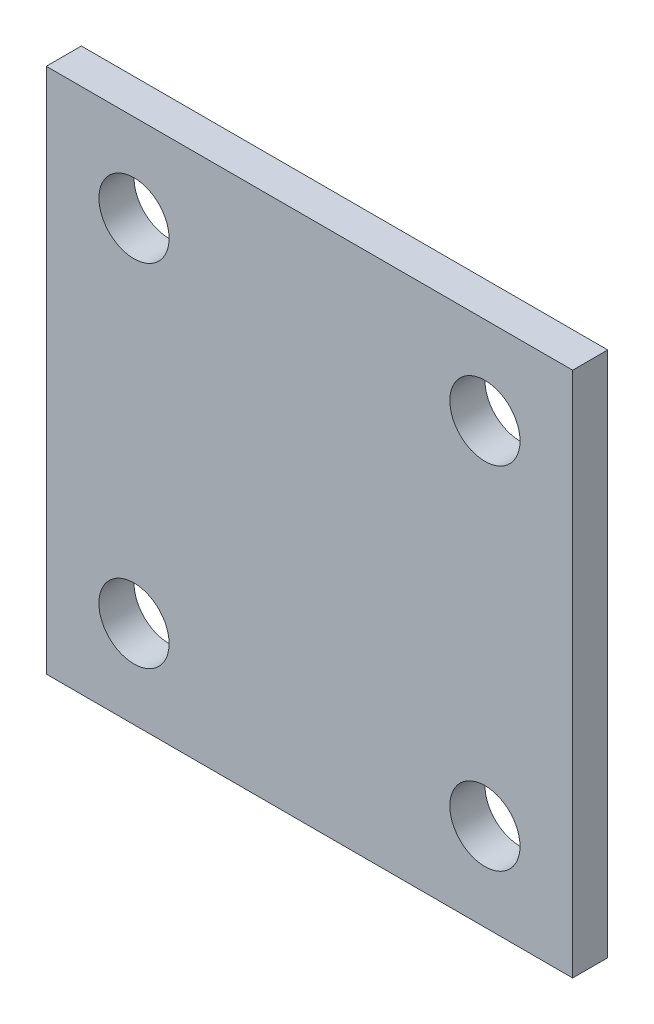
ISO-10303-21;
HEADER;
FILE_DESCRIPTION(('STEP AP214'),'2;1');
FILE_NAME('part.step','',(''),(''),'','','');
FILE_SCHEMA(('AUTOMOTIVE_DESIGN { 1 0 10303 214 1 1 1 1 }'));
ENDSEC;
DATA;
#1=APPLICATION_CONTEXT('core data for automotive mechanical design processes');
#2=APPLICATION_PROTOCOL_DEFINITION('international standard','automotive_design',2000,#1);
#3=PRODUCT_CONTEXT('',#1,'mechanical');
#4=PRODUCT('Part','Part','',(#3));
#5=PRODUCT_RELATED_PRODUCT_CATEGORY('part','',(#4));
#6=PRODUCT_DEFINITION_FORMATION('','',#4);
#7=PRODUCT_DEFINITION_CONTEXT('part definition',#1,'design');
#8=PRODUCT_DEFINITION('design','',#6,#7);
#9=PRODUCT_DEFINITION_SHAPE('','',#8);
#10=(LENGTH_UNIT() NAMED_UNIT(*) SI_UNIT(.MILLI.,.METRE.));
#11=(NAMED_UNIT(*) PLANE_ANGLE_UNIT() SI_UNIT($,.RADIAN.));
#12=(NAMED_UNIT(*) SI_UNIT($,.STERADIAN.) SOLID_ANGLE_UNIT());
#13=UNCERTAINTY_MEASURE_WITH_UNIT(LENGTH_MEASURE(1.E-05),#10,'distance_accuracy_value','');
#14=(GEOMETRIC_REPRESENTATION_CONTEXT(3) GLOBAL_UNCERTAINTY_ASSIGNED_CONTEXT((#13)) GLOBAL_UNIT_ASSIGNED_CONTEXT((#10,
#11,#12)) REPRESENTATION_CONTEXT('',''));
#15=CARTESIAN_POINT('',(0.,0.,0.));
#16=DIRECTION('',(0.,0.,1.));
#17=DIRECTION('',(1.,0.,0.));
#18=AXIS2_PLACEMENT_3D('',#15,#16,#17);
#19=CARTESIAN_POINT('',(0.,0.,100.));
#20=DIRECTION('',(0.,0.,1.));
#21=DIRECTION('',(1.,0.,0.));
#22=AXIS2_PLACEMENT_3D('',#19,#20,#21);
#23=PLANE('',#22);
#24=CARTESIAN_POINT('',(500.,-500.,100.));
#25=DIRECTION('',(0.,0.,1.));
#26=DIRECTION('',(1.,0.,0.));
#27=AXIS2_PLACEMENT_3D('',#24,#25,#26);
#28=CIRCLE('',#27,100.);
#29=CARTESIAN_POINT('',(600.,-500.,100.));
#30=VERTEX_POINT('',#29);
#31=EDGE_CURVE('E121',#30,#30,#28,.T.);
#32=ORIENTED_EDGE('',*,*,#31,.F.);
#33=EDGE_LOOP('',(#32));
#34=FACE_BOUND('',#33,.T.);
#35=CARTESIAN_POINT('',(-500.,500.,100.));
#36=DIRECTION('',(0.,0.,1.));
#37=DIRECTION('',(1.,0.,0.));
#38=AXIS2_PLACEMENT_3D('',#35,#36,#37);
#39=CIRCLE('',#38,100.);
#40=CARTESIAN_POINT('',(-400.,500.,100.));
#41=VERTEX_POINT('',#40);
#42=EDGE_CURVE('E100',#41,#41,#39,.T.);
#43=ORIENTED_EDGE('',*,*,#42,.F.);
#44=EDGE_LOOP('',(#43));
#45=FACE_BOUND('',#44,.T.);
#46=DIRECTION('',(0.,1.,0.));
#47=VECTOR('',#46,1.);
#48=CARTESIAN_POINT('',(750.,750.,100.));
#49=LINE('',#48,#47);
#50=CARTESIAN_POINT('',(750.,-750.,100.));
#51=VERTEX_POINT('',#50);
#52=CARTESIAN_POINT('',(750.,750.,100.));
#53=VERTEX_POINT('',#52);
#54=EDGE_CURVE('E85',#51,#53,#49,.T.);
#55=ORIENTED_EDGE('',*,*,#54,.T.);
#56=DIRECTION('',(-1.,0.,0.));
#57=VECTOR('',#56,1.);
#58=CARTESIAN_POINT('',(-750.,750.,100.));
#59=LINE('',#58,#57);
#60=CARTESIAN_POINT('',(-750.,750.,100.));
#61=VERTEX_POINT('',#60);
#62=EDGE_CURVE('E80',#53,#61,#59,.T.);
#63=ORIENTED_EDGE('',*,*,#62,.T.);
#64=DIRECTION('',(0.,-1.,0.));
#65=VECTOR('',#64,1.);
#66=CARTESIAN_POINT('',(-750.,750.,100.));
#67=LINE('',#66,#65);
#68=CARTESIAN_POINT('',(-750.,-750.,100.));
#69=VERTEX_POINT('',#68);
#70=EDGE_CURVE('E83',#61,#69,#67,.T.);
#71=ORIENTED_EDGE('',*,*,#70,.T.);
#72=DIRECTION('',(1.,0.,0.));
#73=VECTOR('',#72,1.);
#74=CARTESIAN_POINT('',(-750.,-750.,100.));
#75=LINE('',#74,#73);
#76=EDGE_CURVE('E50',#69,#51,#75,.T.);
#77=ORIENTED_EDGE('',*,*,#76,.T.);
#78=EDGE_LOOP('',(#55,#63,#71,#77));
#79=FACE_BOUND('',#78,.T.);
#80=CARTESIAN_POINT('',(500.,500.,100.));
#81=DIRECTION('',(0.,0.,1.));
#82=DIRECTION('',(1.,0.,0.));
#83=AXIS2_PLACEMENT_3D('',#80,#81,#82);
#84=CIRCLE('',#83,100.);
#85=CARTESIAN_POINT('',(600.,500.,100.));
#86=VERTEX_POINT('',#85);
#87=EDGE_CURVE('E115',#86,#86,#84,.T.);
#88=ORIENTED_EDGE('',*,*,#87,.F.);
#89=EDGE_LOOP('',(#88));
#90=FACE_BOUND('',#89,.T.);
#91=CARTESIAN_POINT('',(-500.,-500.,100.));
#92=DIRECTION('',(0.,0.,1.));
#93=DIRECTION('',(1.,0.,0.));
#94=AXIS2_PLACEMENT_3D('',#91,#92,#93);
#95=CIRCLE('',#94,100.);
#96=CARTESIAN_POINT('',(-400.,-500.,100.));
#97=VERTEX_POINT('',#96);
#98=EDGE_CURVE('E127',#97,#97,#95,.T.);
#99=ORIENTED_EDGE('',*,*,#98,.F.);
#100=EDGE_LOOP('',(#99));
#101=FACE_BOUND('',#100,.T.);
#102=ADVANCED_FACE('F33',(#34,#45,#79,#90,#101),#23,.T.);
#103=CARTESIAN_POINT('',(0.,0.,0.));
#104=DIRECTION('',(0.,0.,1.));
#105=DIRECTION('',(1.,0.,0.));
#106=AXIS2_PLACEMENT_3D('',#103,#104,#105);
#107=PLANE('',#106);
#108=DIRECTION('',(0.,1.,0.));
#109=VECTOR('',#108,1.);
#110=CARTESIAN_POINT('',(750.,750.,0.));
#111=LINE('',#110,#109);
#112=CARTESIAN_POINT('',(750.,-750.,0.));
#113=VERTEX_POINT('',#112);
#114=CARTESIAN_POINT('',(750.,750.,0.));
#115=VERTEX_POINT('',#114);
#116=EDGE_CURVE('E97',#113,#115,#111,.T.);
#117=ORIENTED_EDGE('',*,*,#116,.F.);
#118=DIRECTION('',(1.,0.,0.));
#119=VECTOR('',#118,1.);
#120=CARTESIAN_POINT('',(-750.,-750.,0.));
#121=LINE('',#120,#119);
#122=CARTESIAN_POINT('',(-750.,-750.,0.));
#123=VERTEX_POINT('',#122);
#124=EDGE_CURVE('E73',#123,#113,#121,.T.);
#125=ORIENTED_EDGE('',*,*,#124,.F.);
#126=DIRECTION('',(0.,-1.,0.));
#127=VECTOR('',#126,1.);
#128=CARTESIAN_POINT('',(-750.,750.,0.));
#129=LINE('',#128,#127);
#130=CARTESIAN_POINT('',(-750.,750.,0.));
#131=VERTEX_POINT('',#130);
#132=EDGE_CURVE('E67',#131,#123,#129,.T.);
#133=ORIENTED_EDGE('',*,*,#132,.F.);
#134=DIRECTION('',(-1.,0.,0.));
#135=VECTOR('',#134,1.);
#136=CARTESIAN_POINT('',(-750.,750.,0.));
#137=LINE('',#136,#135);
#138=EDGE_CURVE('E89',#115,#131,#137,.T.);
#139=ORIENTED_EDGE('',*,*,#138,.F.);
#140=EDGE_LOOP('',(#117,#125,#133,#139));
#141=FACE_BOUND('',#140,.T.);
#142=CARTESIAN_POINT('',(-500.,500.,0.));
#143=DIRECTION('',(0.,0.,1.));
#144=DIRECTION('',(1.,0.,0.));
#145=AXIS2_PLACEMENT_3D('',#142,#143,#144);
#146=CIRCLE('',#145,100.);
#147=CARTESIAN_POINT('',(-400.,500.,0.));
#148=VERTEX_POINT('',#147);
#149=EDGE_CURVE('E112',#148,#148,#146,.T.);
#150=ORIENTED_EDGE('',*,*,#149,.T.);
#151=EDGE_LOOP('',(#150));
#152=FACE_BOUND('',#151,.T.);
#153=CARTESIAN_POINT('',(500.,500.,0.));
#154=DIRECTION('',(0.,0.,1.));
#155=DIRECTION('',(1.,0.,0.));
#156=AXIS2_PLACEMENT_3D('',#153,#154,#155);
#157=CIRCLE('',#156,100.);
#158=CARTESIAN_POINT('',(600.,500.,0.));
#159=VERTEX_POINT('',#158);
#160=EDGE_CURVE('E118',#159,#159,#157,.T.);
#161=ORIENTED_EDGE('',*,*,#160,.T.);
#162=EDGE_LOOP('',(#161));
#163=FACE_BOUND('',#162,.T.);
#164=CARTESIAN_POINT('',(500.,-500.,0.));
#165=DIRECTION('',(0.,0.,1.));
#166=DIRECTION('',(1.,0.,0.));
#167=AXIS2_PLACEMENT_3D('',#164,#165,#166);
#168=CIRCLE('',#167,100.);
#169=CARTESIAN_POINT('',(600.,-500.,0.));
#170=VERTEX_POINT('',#169);
#171=EDGE_CURVE('E124',#170,#170,#168,.T.);
#172=ORIENTED_EDGE('',*,*,#171,.T.);
#173=EDGE_LOOP('',(#172));
#174=FACE_BOUND('',#173,.T.);
#175=CARTESIAN_POINT('',(-500.,-500.,0.));
#176=DIRECTION('',(0.,0.,1.));
#177=DIRECTION('',(1.,0.,0.));
#178=AXIS2_PLACEMENT_3D('',#175,#176,#177);
#179=CIRCLE('',#178,100.);
#180=CARTESIAN_POINT('',(-400.,-500.,0.));
#181=VERTEX_POINT('',#180);
#182=EDGE_CURVE('E130',#181,#181,#179,.T.);
#183=ORIENTED_EDGE('',*,*,#182,.T.);
#184=EDGE_LOOP('',(#183));
#185=FACE_BOUND('',#184,.T.);
#186=ADVANCED_FACE('F108',(#141,#152,#163,#174,#185),#107,.F.);
#187=CARTESIAN_POINT('',(750.,750.,100.));
#188=DIRECTION('',(-1.,0.,0.));
#189=DIRECTION('',(0.,-1.,0.));
#190=AXIS2_PLACEMENT_3D('',#187,#188,#189);
#191=PLANE('',#190);
#192=ORIENTED_EDGE('',*,*,#116,.T.);
#193=DIRECTION('',(0.,0.,-1.));
#194=VECTOR('',#193,1.);
#195=CARTESIAN_POINT('',(750.,750.,100.));
#196=LINE('',#195,#194);
#197=EDGE_CURVE('E11',#53,#115,#196,.T.);
#198=ORIENTED_EDGE('',*,*,#197,.F.);
#199=ORIENTED_EDGE('',*,*,#54,.F.);
#200=DIRECTION('',(0.,0.,-1.));
#201=VECTOR('',#200,1.);
#202=CARTESIAN_POINT('',(750.,-750.,100.));
#203=LINE('',#202,#201);
#204=EDGE_CURVE('E93',#51,#113,#203,.T.);
#205=ORIENTED_EDGE('',*,*,#204,.T.);
#206=EDGE_LOOP('',(#192,#198,#199,#205));
#207=FACE_BOUND('',#206,.T.);
#208=ADVANCED_FACE('F35',(#207),#191,.F.);
#209=CARTESIAN_POINT('',(-750.,750.,100.));
#210=DIRECTION('',(0.,-1.,0.));
#211=DIRECTION('',(0.,0.,-1.));
#212=AXIS2_PLACEMENT_3D('',#209,#210,#211);
#213=PLANE('',#212);
#214=ORIENTED_EDGE('',*,*,#138,.T.);
#215=DIRECTION('',(0.,0.,-1.));
#216=VECTOR('',#215,1.);
#217=CARTESIAN_POINT('',(-750.,750.,100.));
#218=LINE('',#217,#216);
#219=EDGE_CURVE('E42',#61,#131,#218,.T.);
#220=ORIENTED_EDGE('',*,*,#219,.F.);
#221=ORIENTED_EDGE('',*,*,#62,.F.);
#222=ORIENTED_EDGE('',*,*,#197,.T.);
#223=EDGE_LOOP('',(#214,#220,#221,#222));
#224=FACE_BOUND('',#223,.T.);
#225=ADVANCED_FACE('F88',(#224),#213,.F.);
#226=CARTESIAN_POINT('',(-750.,750.,100.));
#227=DIRECTION('',(1.,0.,0.));
#228=DIRECTION('',(0.,1.,0.));
#229=AXIS2_PLACEMENT_3D('',#226,#227,#228);
#230=PLANE('',#229);
#231=ORIENTED_EDGE('',*,*,#132,.T.);
#232=DIRECTION('',(0.,0.,-1.));
#233=VECTOR('',#232,1.);
#234=CARTESIAN_POINT('',(-750.,-750.,100.));
#235=LINE('',#234,#233);
#236=EDGE_CURVE('E90',#69,#123,#235,.T.);
#237=ORIENTED_EDGE('',*,*,#236,.F.);
#238=ORIENTED_EDGE('',*,*,#70,.F.);
#239=ORIENTED_EDGE('',*,*,#219,.T.);
#240=EDGE_LOOP('',(#231,#237,#238,#239));
#241=FACE_BOUND('',#240,.T.);
#242=ADVANCED_FACE('F91',(#241),#230,.F.);
#243=CARTESIAN_POINT('',(-750.,-750.,100.));
#244=DIRECTION('',(0.,1.,0.));
#245=DIRECTION('',(0.,0.,1.));
#246=AXIS2_PLACEMENT_3D('',#243,#244,#245);
#247=PLANE('',#246);
#248=ORIENTED_EDGE('',*,*,#124,.T.);
#249=ORIENTED_EDGE('',*,*,#204,.F.);
#250=ORIENTED_EDGE('',*,*,#76,.F.);
#251=ORIENTED_EDGE('',*,*,#236,.T.);
#252=EDGE_LOOP('',(#248,#249,#250,#251));
#253=FACE_BOUND('',#252,.T.);
#254=ADVANCED_FACE('F105',(#253),#247,.F.);
#255=CARTESIAN_POINT('',(-500.,500.,100.));
#256=DIRECTION('',(0.,0.,-1.));
#257=DIRECTION('',(-1.,0.,0.));
#258=AXIS2_PLACEMENT_3D('',#255,#256,#257);
#259=CYLINDRICAL_SURFACE('',#258,100.);
#260=ORIENTED_EDGE('',*,*,#42,.T.);
#261=EDGE_LOOP('',(#260));
#262=FACE_BOUND('',#261,.T.);
#263=ORIENTED_EDGE('',*,*,#149,.F.);
#264=EDGE_LOOP('',(#263));
#265=FACE_BOUND('',#264,.T.);
#266=ADVANCED_FACE('F149',(#262,#265),#259,.F.);
#267=CARTESIAN_POINT('',(500.,500.,100.));
#268=DIRECTION('',(0.,0.,-1.));
#269=DIRECTION('',(-1.,0.,0.));
#270=AXIS2_PLACEMENT_3D('',#267,#268,#269);
#271=CYLINDRICAL_SURFACE('',#270,100.);
#272=ORIENTED_EDGE('',*,*,#87,.T.);
#273=EDGE_LOOP('',(#272));
#274=FACE_BOUND('',#273,.T.);
#275=ORIENTED_EDGE('',*,*,#160,.F.);
#276=EDGE_LOOP('',(#275));
#277=FACE_BOUND('',#276,.T.);
#278=ADVANCED_FACE('F195',(#274,#277),#271,.F.);
#279=CARTESIAN_POINT('',(500.,-500.,100.));
#280=DIRECTION('',(0.,0.,-1.));
#281=DIRECTION('',(-1.,0.,0.));
#282=AXIS2_PLACEMENT_3D('',#279,#280,#281);
#283=CYLINDRICAL_SURFACE('',#282,100.);
#284=ORIENTED_EDGE('',*,*,#31,.T.);
#285=EDGE_LOOP('',(#284));
#286=FACE_BOUND('',#285,.T.);
#287=ORIENTED_EDGE('',*,*,#171,.F.);
#288=EDGE_LOOP('',(#287));
#289=FACE_BOUND('',#288,.T.);
#290=ADVANCED_FACE('F203',(#286,#289),#283,.F.);
#291=CARTESIAN_POINT('',(-500.,-500.,100.));
#292=DIRECTION('',(0.,0.,-1.));
#293=DIRECTION('',(-1.,0.,0.));
#294=AXIS2_PLACEMENT_3D('',#291,#292,#293);
#295=CYLINDRICAL_SURFACE('',#294,100.);
#296=ORIENTED_EDGE('',*,*,#98,.T.);
#297=EDGE_LOOP('',(#296));
#298=FACE_BOUND('',#297,.T.);
#299=ORIENTED_EDGE('',*,*,#182,.F.);
#300=EDGE_LOOP('',(#299));
#301=FACE_BOUND('',#300,.T.);
#302=ADVANCED_FACE('F136',(#298,#301),#295,.F.);
#303=CLOSED_SHELL('',(#102,#186,#208,#225,#242,#254,#266,#278,#290,#302));
#304=MANIFOLD_SOLID_BREP('B2',#303);
#305=ADVANCED_BREP_SHAPE_REPRESENTATION('',(#18,#304),#14);
#306=SHAPE_DEFINITION_REPRESENTATION(#9,#305);
ENDSEC;
END-ISO-10303-21;
